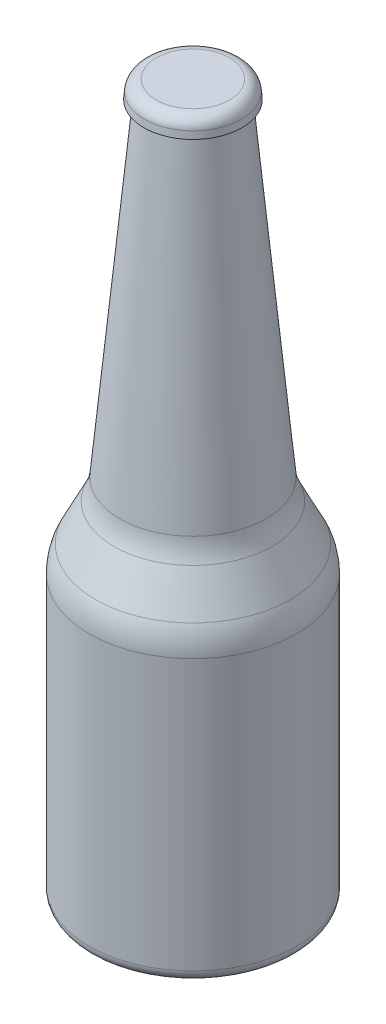
ISO-10303-21;
HEADER;
FILE_DESCRIPTION(('STEP AP214'),'2;1');
FILE_NAME('part.step','',(''),(''),'','','');
FILE_SCHEMA(('AUTOMOTIVE_DESIGN { 1 0 10303 214 1 1 1 1 }'));
ENDSEC;
DATA;
#1=APPLICATION_CONTEXT('core data for automotive mechanical design processes');
#2=APPLICATION_PROTOCOL_DEFINITION('international standard','automotive_design',2000,#1);
#3=PRODUCT_CONTEXT('',#1,'mechanical');
#4=PRODUCT('Part','Part','',(#3));
#5=PRODUCT_RELATED_PRODUCT_CATEGORY('part','',(#4));
#6=PRODUCT_DEFINITION_FORMATION('','',#4);
#7=PRODUCT_DEFINITION_CONTEXT('part definition',#1,'design');
#8=PRODUCT_DEFINITION('design','',#6,#7);
#9=PRODUCT_DEFINITION_SHAPE('','',#8);
#10=(LENGTH_UNIT() NAMED_UNIT(*) SI_UNIT(.MILLI.,.METRE.));
#11=(NAMED_UNIT(*) PLANE_ANGLE_UNIT() SI_UNIT($,.RADIAN.));
#12=(NAMED_UNIT(*) SI_UNIT($,.STERADIAN.) SOLID_ANGLE_UNIT());
#13=UNCERTAINTY_MEASURE_WITH_UNIT(LENGTH_MEASURE(1.E-05),#10,'distance_accuracy_value','');
#14=(GEOMETRIC_REPRESENTATION_CONTEXT(3) GLOBAL_UNCERTAINTY_ASSIGNED_CONTEXT((#13)) GLOBAL_UNIT_ASSIGNED_CONTEXT((#10,
#11,#12)) REPRESENTATION_CONTEXT('',''));
#15=CARTESIAN_POINT('',(0.,0.,0.));
#16=DIRECTION('',(0.,0.,1.));
#17=DIRECTION('',(1.,0.,0.));
#18=AXIS2_PLACEMENT_3D('',#15,#16,#17);
#19=CARTESIAN_POINT('',(0.,0.,0.));
#20=DIRECTION('',(0.,1.,0.));
#21=DIRECTION('',(0.,0.,1.));
#22=AXIS2_PLACEMENT_3D('',#19,#20,#21);
#23=PLANE('',#22);
#24=CARTESIAN_POINT('',(0.,0.,0.));
#25=DIRECTION('',(0.,1.,0.));
#26=DIRECTION('',(0.,0.,1.));
#27=AXIS2_PLACEMENT_3D('',#24,#25,#26);
#28=CIRCLE('',#27,0.155);
#29=CARTESIAN_POINT('',(0.,0.,0.155));
#30=VERTEX_POINT('',#29);
#31=EDGE_CURVE('E37',#30,#30,#28,.F.);
#32=ORIENTED_EDGE('',*,*,#31,.T.);
#33=EDGE_LOOP('',(#32));
#34=FACE_BOUND('',#33,.T.);
#35=ADVANCED_FACE('F30',(#34),#23,.F.);
#36=CARTESIAN_POINT('',(0.,0.,0.));
#37=DIRECTION('',(0.,-1.,0.));
#38=DIRECTION('',(0.,0.,-1.));
#39=AXIS2_PLACEMENT_3D('',#36,#37,#38);
#40=CYLINDRICAL_SURFACE('',#39,0.175);
#41=CARTESIAN_POINT('',(0.,0.02,0.));
#42=DIRECTION('',(0.,1.,0.));
#43=DIRECTION('',(0.,0.,1.));
#44=AXIS2_PLACEMENT_3D('',#41,#42,#43);
#45=CIRCLE('',#44,0.175);
#46=CARTESIAN_POINT('',(0.,0.02,0.175));
#47=VERTEX_POINT('',#46);
#48=EDGE_CURVE('E10',#47,#47,#45,.T.);
#49=ORIENTED_EDGE('',*,*,#48,.T.);
#50=EDGE_LOOP('',(#49));
#51=FACE_BOUND('',#50,.T.);
#52=CARTESIAN_POINT('',(0.,0.476393202250021,0.));
#53=DIRECTION('',(0.,1.,0.));
#54=DIRECTION('',(0.,0.,1.));
#55=AXIS2_PLACEMENT_3D('',#52,#53,#54);
#56=CIRCLE('',#55,0.175);
#57=CARTESIAN_POINT('',(0.,0.476393202250021,0.175));
#58=VERTEX_POINT('',#57);
#59=EDGE_CURVE('E59',#58,#58,#56,.F.);
#60=ORIENTED_EDGE('',*,*,#59,.T.);
#61=EDGE_LOOP('',(#60));
#62=FACE_BOUND('',#61,.T.);
#63=ADVANCED_FACE('F87',(#51,#62),#40,.T.);
#64=CARTESIAN_POINT('',(0.,0.6,0.));
#65=DIRECTION('',(0.,-1.,0.));
#66=DIRECTION('',(0.,0.,-1.));
#67=AXIS2_PLACEMENT_3D('',#64,#65,#66);
#68=CONICAL_SURFACE('',#67,0.125,0.463647609000806);
#69=CARTESIAN_POINT('',(0.,0.521114561800017,0.));
#70=DIRECTION('',(0.,1.,0.));
#71=DIRECTION('',(0.,0.,1.));
#72=AXIS2_PLACEMENT_3D('',#69,#70,#71);
#73=CIRCLE('',#72,0.164442719099992);
#74=CARTESIAN_POINT('',(0.,0.521114561800017,0.164442719099992));
#75=VERTEX_POINT('',#74);
#76=EDGE_CURVE('E53',#75,#75,#73,.T.);
#77=ORIENTED_EDGE('',*,*,#76,.T.);
#78=EDGE_LOOP('',(#77));
#79=FACE_BOUND('',#78,.T.);
#80=CARTESIAN_POINT('',(0.,0.583226113432921,0.));
#81=DIRECTION('',(0.,-1.,0.));
#82=DIRECTION('',(0.,0.,-1.));
#83=AXIS2_PLACEMENT_3D('',#80,#81,#82);
#84=CIRCLE('',#83,0.133386943283539);
#85=CARTESIAN_POINT('',(0.,0.583226113432921,-0.133386943283539));
#86=VERTEX_POINT('',#85);
#87=EDGE_CURVE('E56',#86,#86,#84,.T.);
#88=ORIENTED_EDGE('',*,*,#87,.T.);
#89=EDGE_LOOP('',(#88));
#90=FACE_BOUND('',#89,.T.);
#91=ADVANCED_FACE('F92',(#79,#90),#68,.T.);
#92=CARTESIAN_POINT('',(0.,1.16899453629366,0.));
#93=DIRECTION('',(0.,-1.,0.));
#94=DIRECTION('',(0.,0.,-1.));
#95=AXIS2_PLACEMENT_3D('',#92,#93,#94);
#96=CONICAL_SURFACE('',#95,0.0720000000000002,0.0928787677580615);
#97=CARTESIAN_POINT('',(0.,0.618672944040008,0.));
#98=DIRECTION('',(0.,-1.,0.));
#99=DIRECTION('',(0.,0.,-1.));
#100=AXIS2_PLACEMENT_3D('',#97,#98,#99);
#101=CIRCLE('',#100,0.12326067568141);
#102=CARTESIAN_POINT('',(0.,0.618672944040008,-0.12326067568141));
#103=VERTEX_POINT('',#102);
#104=EDGE_CURVE('E50',#103,#103,#101,.F.);
#105=ORIENTED_EDGE('',*,*,#104,.T.);
#106=EDGE_LOOP('',(#105));
#107=FACE_BOUND('',#106,.T.);
#108=CARTESIAN_POINT('',(0.,1.16899453629366,0.));
#109=DIRECTION('',(0.,-1.,0.));
#110=DIRECTION('',(0.,0.,-1.));
#111=AXIS2_PLACEMENT_3D('',#108,#109,#110);
#112=CIRCLE('',#111,0.0720000000000002);
#113=CARTESIAN_POINT('',(0.,1.16899453629366,-0.0720000000000002));
#114=VERTEX_POINT('',#113);
#115=EDGE_CURVE('E62',#114,#114,#112,.T.);
#116=ORIENTED_EDGE('',*,*,#115,.T.);
#117=EDGE_LOOP('',(#116));
#118=FACE_BOUND('',#117,.T.);
#119=ADVANCED_FACE('F83',(#107,#118),#96,.T.);
#120=CARTESIAN_POINT('',(0.,1.17,0.));
#121=DIRECTION('',(0.,1.,0.));
#122=DIRECTION('',(0.,0.,1.));
#123=AXIS2_PLACEMENT_3D('',#120,#121,#122);
#124=CONICAL_SURFACE('',#123,0.0827944029311022,1.47791755903684);
#125=ORIENTED_EDGE('',*,*,#115,.F.);
#126=EDGE_LOOP('',(#125));
#127=FACE_BOUND('',#126,.T.);
#128=CARTESIAN_POINT('',(0.,1.17,0.));
#129=DIRECTION('',(0.,-1.,0.));
#130=DIRECTION('',(0.,0.,-1.));
#131=AXIS2_PLACEMENT_3D('',#128,#129,#130);
#132=CIRCLE('',#131,0.0827944029311022);
#133=CARTESIAN_POINT('',(0.,1.17,-0.0827944029311022));
#134=VERTEX_POINT('',#133);
#135=EDGE_CURVE('E65',#134,#134,#132,.T.);
#136=ORIENTED_EDGE('',*,*,#135,.T.);
#137=EDGE_LOOP('',(#136));
#138=FACE_BOUND('',#137,.T.);
#139=ADVANCED_FACE('F69',(#127,#138),#124,.T.);
#140=CARTESIAN_POINT('',(0.,1.2,0.));
#141=DIRECTION('',(0.,-1.,0.));
#142=DIRECTION('',(0.,0.,-1.));
#143=AXIS2_PLACEMENT_3D('',#140,#141,#142);
#144=CONICAL_SURFACE('',#143,0.08,0.0928787677580688);
#145=CARTESIAN_POINT('',(0.,1.18185490578858,0.));
#146=DIRECTION('',(0.,1.,0.));
#147=DIRECTION('',(0.,0.,1.));
#148=AXIS2_PLACEMENT_3D('',#145,#146,#147);
#149=CIRCLE('',#148,0.0816901568149837);
#150=CARTESIAN_POINT('',(0.,1.18185490578858,0.0816901568149837));
#151=VERTEX_POINT('',#150);
#152=EDGE_CURVE('E45',#151,#151,#149,.F.);
#153=ORIENTED_EDGE('',*,*,#152,.T.);
#154=EDGE_LOOP('',(#153));
#155=FACE_BOUND('',#154,.T.);
#156=ORIENTED_EDGE('',*,*,#135,.F.);
#157=EDGE_LOOP('',(#156));
#158=FACE_BOUND('',#157,.T.);
#159=ADVANCED_FACE('F71',(#155,#158),#144,.T.);
#160=CARTESIAN_POINT('',(0.,1.2,0.));
#161=DIRECTION('',(0.,-1.,0.));
#162=DIRECTION('',(0.,0.,-1.));
#163=AXIS2_PLACEMENT_3D('',#160,#161,#162);
#164=PLANE('',#163);
#165=CARTESIAN_POINT('',(0.,1.2,0.));
#166=DIRECTION('',(0.,-1.,0.));
#167=DIRECTION('',(0.,0.,-1.));
#168=AXIS2_PLACEMENT_3D('',#165,#166,#167);
#169=CIRCLE('',#168,0.0617763594745595);
#170=CARTESIAN_POINT('',(0.,1.2,-0.0617763594745595));
#171=VERTEX_POINT('',#170);
#172=EDGE_CURVE('E41',#171,#171,#169,.F.);
#173=ORIENTED_EDGE('',*,*,#172,.T.);
#174=EDGE_LOOP('',(#173));
#175=FACE_BOUND('',#174,.T.);
#176=ADVANCED_FACE('F73',(#175),#164,.F.);
#177=CARTESIAN_POINT('',(0.,0.476393202250021,0.));
#178=DIRECTION('',(0.,1.,0.));
#179=DIRECTION('',(0.,0.,1.));
#180=AXIS2_PLACEMENT_3D('',#177,#178,#179);
#181=DEGENERATE_TOROIDAL_SURFACE('',#180,0.075,0.1,.T.);
#182=ORIENTED_EDGE('',*,*,#76,.F.);
#183=EDGE_LOOP('',(#182));
#184=FACE_BOUND('',#183,.T.);
#185=ORIENTED_EDGE('',*,*,#59,.F.);
#186=EDGE_LOOP('',(#185));
#187=FACE_BOUND('',#186,.T.);
#188=ADVANCED_FACE('F80',(#184,#187),#181,.T.);
#189=CARTESIAN_POINT('',(0.,0.627947472982917,0.));
#190=DIRECTION('',(0.,-1.,0.));
#191=DIRECTION('',(0.,0.,-1.));
#192=AXIS2_PLACEMENT_3D('',#189,#190,#191);
#193=TOROIDAL_SURFACE('',#192,0.222829662383531,0.1);
#194=ORIENTED_EDGE('',*,*,#104,.F.);
#195=EDGE_LOOP('',(#194));
#196=FACE_BOUND('',#195,.T.);
#197=ORIENTED_EDGE('',*,*,#87,.F.);
#198=EDGE_LOOP('',(#197));
#199=FACE_BOUND('',#198,.T.);
#200=ADVANCED_FACE('F98',(#196,#199),#193,.F.);
#201=CARTESIAN_POINT('',(0.,1.18,0.));
#202=DIRECTION('',(0.,-1.,0.));
#203=DIRECTION('',(0.,0.,-1.));
#204=AXIS2_PLACEMENT_3D('',#201,#202,#203);
#205=TOROIDAL_SURFACE('',#204,0.0617763594745595,0.02);
#206=ORIENTED_EDGE('',*,*,#172,.F.);
#207=EDGE_LOOP('',(#206));
#208=FACE_BOUND('',#207,.T.);
#209=ORIENTED_EDGE('',*,*,#152,.F.);
#210=EDGE_LOOP('',(#209));
#211=FACE_BOUND('',#210,.T.);
#212=ADVANCED_FACE('F101',(#208,#211),#205,.T.);
#213=CARTESIAN_POINT('',(0.,0.02,0.));
#214=DIRECTION('',(0.,1.,0.));
#215=DIRECTION('',(0.,0.,1.));
#216=AXIS2_PLACEMENT_3D('',#213,#214,#215);
#217=TOROIDAL_SURFACE('',#216,0.155,0.02);
#218=ORIENTED_EDGE('',*,*,#48,.F.);
#219=EDGE_LOOP('',(#218));
#220=FACE_BOUND('',#219,.T.);
#221=ORIENTED_EDGE('',*,*,#31,.F.);
#222=EDGE_LOOP('',(#221));
#223=FACE_BOUND('',#222,.T.);
#224=ADVANCED_FACE('F32',(#220,#223),#217,.T.);
#225=CLOSED_SHELL('',(#35,#63,#91,#119,#139,#159,#176,#188,#200,#212,#224));
#226=MANIFOLD_SOLID_BREP('B2',#225);
#227=ADVANCED_BREP_SHAPE_REPRESENTATION('',(#18,#226),#14);
#228=SHAPE_DEFINITION_REPRESENTATION(#9,#227);
ENDSEC;
END-ISO-10303-21;
